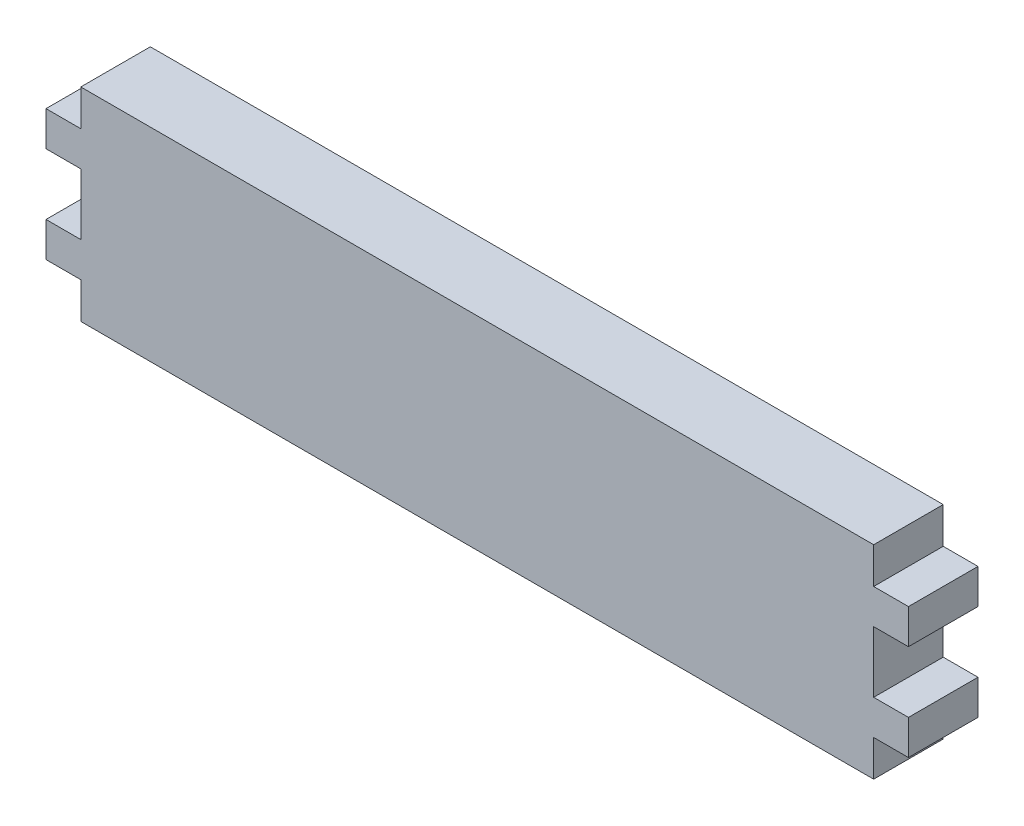
ISO-10303-21;
HEADER;
FILE_DESCRIPTION(('STEP AP214'),'2;1');
FILE_NAME('part.step','',(''),(''),'','','');
FILE_SCHEMA(('AUTOMOTIVE_DESIGN { 1 0 10303 214 1 1 1 1 }'));
ENDSEC;
DATA;
#1=APPLICATION_CONTEXT('core data for automotive mechanical design processes');
#2=APPLICATION_PROTOCOL_DEFINITION('international standard','automotive_design',2000,#1);
#3=PRODUCT_CONTEXT('',#1,'mechanical');
#4=PRODUCT('Part','Part','',(#3));
#5=PRODUCT_RELATED_PRODUCT_CATEGORY('part','',(#4));
#6=PRODUCT_DEFINITION_FORMATION('','',#4);
#7=PRODUCT_DEFINITION_CONTEXT('part definition',#1,'design');
#8=PRODUCT_DEFINITION('design','',#6,#7);
#9=PRODUCT_DEFINITION_SHAPE('','',#8);
#10=(LENGTH_UNIT() NAMED_UNIT(*) SI_UNIT(.MILLI.,.METRE.));
#11=(NAMED_UNIT(*) PLANE_ANGLE_UNIT() SI_UNIT($,.RADIAN.));
#12=(NAMED_UNIT(*) SI_UNIT($,.STERADIAN.) SOLID_ANGLE_UNIT());
#13=UNCERTAINTY_MEASURE_WITH_UNIT(LENGTH_MEASURE(1.E-05),#10,'distance_accuracy_value','');
#14=(GEOMETRIC_REPRESENTATION_CONTEXT(3) GLOBAL_UNCERTAINTY_ASSIGNED_CONTEXT((#13)) GLOBAL_UNIT_ASSIGNED_CONTEXT((#10,
#11,#12)) REPRESENTATION_CONTEXT('',''));
#15=CARTESIAN_POINT('',(0.,0.,0.));
#16=DIRECTION('',(0.,0.,1.));
#17=DIRECTION('',(1.,0.,0.));
#18=AXIS2_PLACEMENT_3D('',#15,#16,#17);
#19=CARTESIAN_POINT('',(308.587272516352,-10.5892165461423,87.2437164679682));
#20=DIRECTION('',(0.,-1.,0.));
#21=DIRECTION('',(0.,0.,-1.));
#22=AXIS2_PLACEMENT_3D('',#19,#20,#21);
#23=PLANE('',#22);
#24=DIRECTION('',(-1.,0.,0.));
#25=VECTOR('',#24,1.);
#26=CARTESIAN_POINT('',(308.587272516352,-10.5892165461423,6.35000000000004));
#27=LINE('',#26,#25);
#28=CARTESIAN_POINT('',(308.587272516352,-10.5892165461423,6.35000000000004));
#29=VERTEX_POINT('',#28);
#30=CARTESIAN_POINT('',(305.412272516352,-10.5892165461423,6.35000000000004));
#31=VERTEX_POINT('',#30);
#32=EDGE_CURVE('E242',#29,#31,#27,.T.);
#33=ORIENTED_EDGE('',*,*,#32,.F.);
#34=DIRECTION('',(0.,0.,-1.));
#35=VECTOR('',#34,1.);
#36=CARTESIAN_POINT('',(308.587272516352,-10.5892165461423,87.2437164679682));
#37=LINE('',#36,#35);
#38=CARTESIAN_POINT('',(308.587272516352,-10.5892165461423,0.));
#39=VERTEX_POINT('',#38);
#40=EDGE_CURVE('E36',#29,#39,#37,.T.);
#41=ORIENTED_EDGE('',*,*,#40,.T.);
#42=DIRECTION('',(-1.,0.,0.));
#43=VECTOR('',#42,1.);
#44=CARTESIAN_POINT('',(308.587272516352,-10.5892165461423,0.));
#45=LINE('',#44,#43);
#46=CARTESIAN_POINT('',(305.412272516352,-10.5892165461423,0.));
#47=VERTEX_POINT('',#46);
#48=EDGE_CURVE('E250',#39,#47,#45,.T.);
#49=ORIENTED_EDGE('',*,*,#48,.T.);
#50=DIRECTION('',(0.,0.,-1.));
#51=VECTOR('',#50,1.);
#52=CARTESIAN_POINT('',(305.412272516352,-10.5892165461423,87.2437164679682));
#53=LINE('',#52,#51);
#54=EDGE_CURVE('E135',#31,#47,#53,.T.);
#55=ORIENTED_EDGE('',*,*,#54,.F.);
#56=EDGE_LOOP('',(#33,#41,#49,#55));
#57=FACE_BOUND('',#56,.T.);
#58=ADVANCED_FACE('F32',(#57),#23,.F.);
#59=CARTESIAN_POINT('',(305.412272516352,-10.5892165461423,87.2437164679682));
#60=DIRECTION('',(-1.,0.,0.));
#61=DIRECTION('',(0.,0.,1.));
#62=AXIS2_PLACEMENT_3D('',#59,#60,#61);
#63=PLANE('',#62);
#64=DIRECTION('',(0.,1.,0.));
#65=VECTOR('',#64,1.);
#66=CARTESIAN_POINT('',(305.412272516352,-10.5892165461423,6.35000000000004));
#67=LINE('',#66,#65);
#68=CARTESIAN_POINT('',(305.412272516352,-7.28721654614226,6.35000000000004));
#69=VERTEX_POINT('',#68);
#70=EDGE_CURVE('E142',#31,#69,#67,.T.);
#71=ORIENTED_EDGE('',*,*,#70,.F.);
#72=ORIENTED_EDGE('',*,*,#54,.T.);
#73=DIRECTION('',(0.,1.,0.));
#74=VECTOR('',#73,1.);
#75=CARTESIAN_POINT('',(305.412272516352,-10.5892165461423,0.));
#76=LINE('',#75,#74);
#77=CARTESIAN_POINT('',(305.412272516352,-7.28721654614226,0.));
#78=VERTEX_POINT('',#77);
#79=EDGE_CURVE('E249',#47,#78,#76,.T.);
#80=ORIENTED_EDGE('',*,*,#79,.T.);
#81=DIRECTION('',(0.,0.,-1.));
#82=VECTOR('',#81,1.);
#83=CARTESIAN_POINT('',(305.412272516352,-7.28721654614226,87.2437164679682));
#84=LINE('',#83,#82);
#85=EDGE_CURVE('E251',#69,#78,#84,.T.);
#86=ORIENTED_EDGE('',*,*,#85,.F.);
#87=EDGE_LOOP('',(#71,#72,#80,#86));
#88=FACE_BOUND('',#87,.T.);
#89=ADVANCED_FACE('F330',(#88),#63,.F.);
#90=CARTESIAN_POINT('',(305.412272516352,-7.28721654614226,87.2437164679682));
#91=DIRECTION('',(0.,-1.,0.));
#92=DIRECTION('',(1.,0.,0.));
#93=AXIS2_PLACEMENT_3D('',#90,#91,#92);
#94=PLANE('',#93);
#95=DIRECTION('',(-1.,0.,0.));
#96=VECTOR('',#95,1.);
#97=CARTESIAN_POINT('',(305.412272516352,-7.28721654614226,6.35000000000004));
#98=LINE('',#97,#96);
#99=CARTESIAN_POINT('',(233.022272516352,-7.28721654614227,6.35000000000004));
#100=VERTEX_POINT('',#99);
#101=EDGE_CURVE('E238',#69,#100,#98,.T.);
#102=ORIENTED_EDGE('',*,*,#101,.F.);
#103=ORIENTED_EDGE('',*,*,#85,.T.);
#104=DIRECTION('',(-1.,0.,0.));
#105=VECTOR('',#104,1.);
#106=CARTESIAN_POINT('',(305.412272516352,-7.28721654614226,0.));
#107=LINE('',#106,#105);
#108=CARTESIAN_POINT('',(233.022272516352,-7.28721654614227,0.));
#109=VERTEX_POINT('',#108);
#110=EDGE_CURVE('E253',#78,#109,#107,.T.);
#111=ORIENTED_EDGE('',*,*,#110,.T.);
#112=DIRECTION('',(0.,0.,-1.));
#113=VECTOR('',#112,1.);
#114=CARTESIAN_POINT('',(233.022272516352,-7.28721654614227,87.2437164679682));
#115=LINE('',#114,#113);
#116=EDGE_CURVE('E254',#100,#109,#115,.T.);
#117=ORIENTED_EDGE('',*,*,#116,.F.);
#118=EDGE_LOOP('',(#102,#103,#111,#117));
#119=FACE_BOUND('',#118,.T.);
#120=ADVANCED_FACE('F334',(#119),#94,.F.);
#121=CARTESIAN_POINT('',(233.022272516352,-7.28721654614227,87.2437164679682));
#122=DIRECTION('',(1.,0.,0.));
#123=DIRECTION('',(0.,0.,-1.));
#124=AXIS2_PLACEMENT_3D('',#121,#122,#123);
#125=PLANE('',#124);
#126=DIRECTION('',(0.,-1.,0.));
#127=VECTOR('',#126,1.);
#128=CARTESIAN_POINT('',(233.022272516352,-7.28721654614227,6.35000000000004));
#129=LINE('',#128,#127);
#130=CARTESIAN_POINT('',(233.022272516352,-10.5892165461423,6.35000000000004));
#131=VERTEX_POINT('',#130);
#132=EDGE_CURVE('E213',#100,#131,#129,.T.);
#133=ORIENTED_EDGE('',*,*,#132,.F.);
#134=ORIENTED_EDGE('',*,*,#116,.T.);
#135=DIRECTION('',(0.,-1.,0.));
#136=VECTOR('',#135,1.);
#137=CARTESIAN_POINT('',(233.022272516352,-7.28721654614227,0.));
#138=LINE('',#137,#136);
#139=CARTESIAN_POINT('',(233.022272516352,-10.5892165461423,0.));
#140=VERTEX_POINT('',#139);
#141=EDGE_CURVE('E235',#109,#140,#138,.T.);
#142=ORIENTED_EDGE('',*,*,#141,.T.);
#143=DIRECTION('',(0.,0.,-1.));
#144=VECTOR('',#143,1.);
#145=CARTESIAN_POINT('',(233.022272516352,-10.5892165461423,87.2437164679682));
#146=LINE('',#145,#144);
#147=EDGE_CURVE('E232',#131,#140,#146,.T.);
#148=ORIENTED_EDGE('',*,*,#147,.F.);
#149=EDGE_LOOP('',(#133,#134,#142,#148));
#150=FACE_BOUND('',#149,.T.);
#151=ADVANCED_FACE('F336',(#150),#125,.F.);
#152=CARTESIAN_POINT('',(229.847272516352,-10.5892165461423,87.2437164679682));
#153=DIRECTION('',(0.,1.,0.));
#154=DIRECTION('',(-1.,0.,0.));
#155=AXIS2_PLACEMENT_3D('',#152,#153,#154);
#156=PLANE('',#155);
#157=DIRECTION('',(0.,0.,-1.));
#158=VECTOR('',#157,1.);
#159=CARTESIAN_POINT('',(229.847272516352,-10.5892165461423,87.2437164679682));
#160=LINE('',#159,#158);
#161=CARTESIAN_POINT('',(229.847272516352,-10.5892165461423,6.35000000000004));
#162=VERTEX_POINT('',#161);
#163=CARTESIAN_POINT('',(229.847272516352,-10.5892165461423,0.));
#164=VERTEX_POINT('',#163);
#165=EDGE_CURVE('E229',#162,#164,#160,.T.);
#166=ORIENTED_EDGE('',*,*,#165,.F.);
#167=DIRECTION('',(1.,0.,0.));
#168=VECTOR('',#167,1.);
#169=CARTESIAN_POINT('',(229.847272516352,-10.5892165461423,6.35000000000004));
#170=LINE('',#169,#168);
#171=EDGE_CURVE('E233',#162,#131,#170,.T.);
#172=ORIENTED_EDGE('',*,*,#171,.T.);
#173=ORIENTED_EDGE('',*,*,#147,.T.);
#174=DIRECTION('',(1.,0.,0.));
#175=VECTOR('',#174,1.);
#176=CARTESIAN_POINT('',(229.847272516352,-10.5892165461423,0.));
#177=LINE('',#176,#175);
#178=EDGE_CURVE('E247',#164,#140,#177,.T.);
#179=ORIENTED_EDGE('',*,*,#178,.F.);
#180=EDGE_LOOP('',(#166,#172,#173,#179));
#181=FACE_BOUND('',#180,.T.);
#182=ADVANCED_FACE('F341',(#181),#156,.T.);
#183=CARTESIAN_POINT('',(229.847272516352,-13.7642165461423,87.2437164679682));
#184=DIRECTION('',(-1.,0.,0.));
#185=DIRECTION('',(0.,0.,1.));
#186=AXIS2_PLACEMENT_3D('',#183,#184,#185);
#187=PLANE('',#186);
#188=DIRECTION('',(0.,0.,-1.));
#189=VECTOR('',#188,1.);
#190=CARTESIAN_POINT('',(229.847272516352,-13.7642165461423,87.2437164679682));
#191=LINE('',#190,#189);
#192=CARTESIAN_POINT('',(229.847272516352,-13.7642165461423,6.35000000000004));
#193=VERTEX_POINT('',#192);
#194=CARTESIAN_POINT('',(229.847272516352,-13.7642165461423,0.));
#195=VERTEX_POINT('',#194);
#196=EDGE_CURVE('E226',#193,#195,#191,.T.);
#197=ORIENTED_EDGE('',*,*,#196,.F.);
#198=DIRECTION('',(0.,1.,0.));
#199=VECTOR('',#198,1.);
#200=CARTESIAN_POINT('',(229.847272516352,-13.7642165461423,6.35000000000004));
#201=LINE('',#200,#199);
#202=EDGE_CURVE('E230',#193,#162,#201,.T.);
#203=ORIENTED_EDGE('',*,*,#202,.T.);
#204=ORIENTED_EDGE('',*,*,#165,.T.);
#205=DIRECTION('',(0.,1.,0.));
#206=VECTOR('',#205,1.);
#207=CARTESIAN_POINT('',(229.847272516352,-13.7642165461423,0.));
#208=LINE('',#207,#206);
#209=EDGE_CURVE('E313',#195,#164,#208,.T.);
#210=ORIENTED_EDGE('',*,*,#209,.F.);
#211=EDGE_LOOP('',(#197,#203,#204,#210));
#212=FACE_BOUND('',#211,.T.);
#213=ADVANCED_FACE('F347',(#212),#187,.T.);
#214=CARTESIAN_POINT('',(233.022272516352,-13.7642165461423,87.2437164679682));
#215=DIRECTION('',(0.,-1.,0.));
#216=DIRECTION('',(1.,0.,0.));
#217=AXIS2_PLACEMENT_3D('',#214,#215,#216);
#218=PLANE('',#217);
#219=DIRECTION('',(0.,0.,-1.));
#220=VECTOR('',#219,1.);
#221=CARTESIAN_POINT('',(233.022272516352,-13.7642165461423,87.2437164679682));
#222=LINE('',#221,#220);
#223=CARTESIAN_POINT('',(233.022272516352,-13.7642165461423,6.35000000000004));
#224=VERTEX_POINT('',#223);
#225=CARTESIAN_POINT('',(233.022272516352,-13.7642165461423,0.));
#226=VERTEX_POINT('',#225);
#227=EDGE_CURVE('E223',#224,#226,#222,.T.);
#228=ORIENTED_EDGE('',*,*,#227,.F.);
#229=DIRECTION('',(-1.,0.,0.));
#230=VECTOR('',#229,1.);
#231=CARTESIAN_POINT('',(233.022272516352,-13.7642165461423,6.35000000000004));
#232=LINE('',#231,#230);
#233=EDGE_CURVE('E227',#224,#193,#232,.T.);
#234=ORIENTED_EDGE('',*,*,#233,.T.);
#235=ORIENTED_EDGE('',*,*,#196,.T.);
#236=DIRECTION('',(-1.,0.,0.));
#237=VECTOR('',#236,1.);
#238=CARTESIAN_POINT('',(233.022272516352,-13.7642165461423,0.));
#239=LINE('',#238,#237);
#240=EDGE_CURVE('E310',#226,#195,#239,.T.);
#241=ORIENTED_EDGE('',*,*,#240,.F.);
#242=EDGE_LOOP('',(#228,#234,#235,#241));
#243=FACE_BOUND('',#242,.T.);
#244=ADVANCED_FACE('F352',(#243),#218,.T.);
#245=CARTESIAN_POINT('',(233.022272516352,-19.3522165461423,87.2437164679682));
#246=DIRECTION('',(-1.,0.,0.));
#247=DIRECTION('',(0.,0.,1.));
#248=AXIS2_PLACEMENT_3D('',#245,#246,#247);
#249=PLANE('',#248);
#250=DIRECTION('',(0.,0.,-1.));
#251=VECTOR('',#250,1.);
#252=CARTESIAN_POINT('',(233.022272516352,-19.3522165461423,87.2437164679682));
#253=LINE('',#252,#251);
#254=CARTESIAN_POINT('',(233.022272516352,-19.3522165461423,6.35000000000004));
#255=VERTEX_POINT('',#254);
#256=CARTESIAN_POINT('',(233.022272516352,-19.3522165461423,0.));
#257=VERTEX_POINT('',#256);
#258=EDGE_CURVE('E220',#255,#257,#253,.T.);
#259=ORIENTED_EDGE('',*,*,#258,.F.);
#260=DIRECTION('',(0.,1.,0.));
#261=VECTOR('',#260,1.);
#262=CARTESIAN_POINT('',(233.022272516352,-19.3522165461423,6.35000000000004));
#263=LINE('',#262,#261);
#264=EDGE_CURVE('E224',#255,#224,#263,.T.);
#265=ORIENTED_EDGE('',*,*,#264,.T.);
#266=ORIENTED_EDGE('',*,*,#227,.T.);
#267=DIRECTION('',(0.,1.,0.));
#268=VECTOR('',#267,1.);
#269=CARTESIAN_POINT('',(233.022272516352,-19.3522165461423,0.));
#270=LINE('',#269,#268);
#271=EDGE_CURVE('E307',#257,#226,#270,.T.);
#272=ORIENTED_EDGE('',*,*,#271,.F.);
#273=EDGE_LOOP('',(#259,#265,#266,#272));
#274=FACE_BOUND('',#273,.T.);
#275=ADVANCED_FACE('F356',(#274),#249,.T.);
#276=CARTESIAN_POINT('',(229.847272516352,-19.3522165461423,87.2437164679682));
#277=DIRECTION('',(0.,1.,0.));
#278=DIRECTION('',(-1.,0.,0.));
#279=AXIS2_PLACEMENT_3D('',#276,#277,#278);
#280=PLANE('',#279);
#281=DIRECTION('',(0.,0.,-1.));
#282=VECTOR('',#281,1.);
#283=CARTESIAN_POINT('',(229.847272516352,-19.3522165461423,87.2437164679682));
#284=LINE('',#283,#282);
#285=CARTESIAN_POINT('',(229.847272516352,-19.3522165461423,6.35000000000004));
#286=VERTEX_POINT('',#285);
#287=CARTESIAN_POINT('',(229.847272516352,-19.3522165461423,0.));
#288=VERTEX_POINT('',#287);
#289=EDGE_CURVE('E217',#286,#288,#284,.T.);
#290=ORIENTED_EDGE('',*,*,#289,.F.);
#291=DIRECTION('',(1.,0.,0.));
#292=VECTOR('',#291,1.);
#293=CARTESIAN_POINT('',(229.847272516352,-19.3522165461423,6.35000000000004));
#294=LINE('',#293,#292);
#295=EDGE_CURVE('E221',#286,#255,#294,.T.);
#296=ORIENTED_EDGE('',*,*,#295,.T.);
#297=ORIENTED_EDGE('',*,*,#258,.T.);
#298=DIRECTION('',(1.,0.,0.));
#299=VECTOR('',#298,1.);
#300=CARTESIAN_POINT('',(229.847272516352,-19.3522165461423,0.));
#301=LINE('',#300,#299);
#302=EDGE_CURVE('E304',#288,#257,#301,.T.);
#303=ORIENTED_EDGE('',*,*,#302,.F.);
#304=EDGE_LOOP('',(#290,#296,#297,#303));
#305=FACE_BOUND('',#304,.T.);
#306=ADVANCED_FACE('F362',(#305),#280,.T.);
#307=CARTESIAN_POINT('',(229.847272516352,-22.5272165461423,87.2437164679682));
#308=DIRECTION('',(-1.,0.,0.));
#309=DIRECTION('',(0.,0.,1.));
#310=AXIS2_PLACEMENT_3D('',#307,#308,#309);
#311=PLANE('',#310);
#312=DIRECTION('',(0.,0.,-1.));
#313=VECTOR('',#312,1.);
#314=CARTESIAN_POINT('',(229.847272516352,-22.5272165461423,87.2437164679682));
#315=LINE('',#314,#313);
#316=CARTESIAN_POINT('',(229.847272516352,-22.5272165461423,6.35000000000004));
#317=VERTEX_POINT('',#316);
#318=CARTESIAN_POINT('',(229.847272516352,-22.5272165461423,0.));
#319=VERTEX_POINT('',#318);
#320=EDGE_CURVE('E216',#317,#319,#315,.T.);
#321=ORIENTED_EDGE('',*,*,#320,.F.);
#322=DIRECTION('',(0.,1.,0.));
#323=VECTOR('',#322,1.);
#324=CARTESIAN_POINT('',(229.847272516352,-22.5272165461423,6.35000000000004));
#325=LINE('',#324,#323);
#326=EDGE_CURVE('E218',#317,#286,#325,.T.);
#327=ORIENTED_EDGE('',*,*,#326,.T.);
#328=ORIENTED_EDGE('',*,*,#289,.T.);
#329=DIRECTION('',(0.,1.,0.));
#330=VECTOR('',#329,1.);
#331=CARTESIAN_POINT('',(229.847272516352,-22.5272165461423,0.));
#332=LINE('',#331,#330);
#333=EDGE_CURVE('E301',#319,#288,#332,.T.);
#334=ORIENTED_EDGE('',*,*,#333,.F.);
#335=EDGE_LOOP('',(#321,#327,#328,#334));
#336=FACE_BOUND('',#335,.T.);
#337=ADVANCED_FACE('F367',(#336),#311,.T.);
#338=CARTESIAN_POINT('',(233.022272516352,-22.5272165461423,87.2437164679682));
#339=DIRECTION('',(0.,-1.,0.));
#340=DIRECTION('',(1.,0.,0.));
#341=AXIS2_PLACEMENT_3D('',#338,#339,#340);
#342=PLANE('',#341);
#343=DIRECTION('',(0.,0.,-1.));
#344=VECTOR('',#343,1.);
#345=CARTESIAN_POINT('',(233.022272516352,-22.5272165461423,87.2437164679682));
#346=LINE('',#345,#344);
#347=CARTESIAN_POINT('',(233.022272516352,-22.5272165461423,6.35000000000004));
#348=VERTEX_POINT('',#347);
#349=CARTESIAN_POINT('',(233.022272516352,-22.5272165461423,0.));
#350=VERTEX_POINT('',#349);
#351=EDGE_CURVE('E263',#348,#350,#346,.T.);
#352=ORIENTED_EDGE('',*,*,#351,.F.);
#353=DIRECTION('',(-1.,0.,0.));
#354=VECTOR('',#353,1.);
#355=CARTESIAN_POINT('',(233.022272516352,-22.5272165461423,6.35000000000004));
#356=LINE('',#355,#354);
#357=EDGE_CURVE('E214',#348,#317,#356,.T.);
#358=ORIENTED_EDGE('',*,*,#357,.T.);
#359=ORIENTED_EDGE('',*,*,#320,.T.);
#360=DIRECTION('',(-1.,0.,0.));
#361=VECTOR('',#360,1.);
#362=CARTESIAN_POINT('',(233.022272516352,-22.5272165461423,0.));
#363=LINE('',#362,#361);
#364=EDGE_CURVE('E288',#350,#319,#363,.T.);
#365=ORIENTED_EDGE('',*,*,#364,.F.);
#366=EDGE_LOOP('',(#352,#358,#359,#365));
#367=FACE_BOUND('',#366,.T.);
#368=ADVANCED_FACE('F371',(#367),#342,.T.);
#369=CARTESIAN_POINT('',(233.022272516352,-22.5272165461423,87.2437164679682));
#370=DIRECTION('',(1.,0.,0.));
#371=DIRECTION('',(0.,0.,-1.));
#372=AXIS2_PLACEMENT_3D('',#369,#370,#371);
#373=PLANE('',#372);
#374=DIRECTION('',(0.,-1.,0.));
#375=VECTOR('',#374,1.);
#376=CARTESIAN_POINT('',(233.022272516352,-22.5272165461423,6.35000000000004));
#377=LINE('',#376,#375);
#378=CARTESIAN_POINT('',(233.022272516352,-25.8292165461423,6.35000000000004));
#379=VERTEX_POINT('',#378);
#380=EDGE_CURVE('E210',#348,#379,#377,.T.);
#381=ORIENTED_EDGE('',*,*,#380,.F.);
#382=ORIENTED_EDGE('',*,*,#351,.T.);
#383=DIRECTION('',(0.,-1.,0.));
#384=VECTOR('',#383,1.);
#385=CARTESIAN_POINT('',(233.022272516352,-22.5272165461423,0.));
#386=LINE('',#385,#384);
#387=CARTESIAN_POINT('',(233.022272516352,-25.8292165461423,0.));
#388=VERTEX_POINT('',#387);
#389=EDGE_CURVE('E265',#350,#388,#386,.T.);
#390=ORIENTED_EDGE('',*,*,#389,.T.);
#391=DIRECTION('',(0.,0.,-1.));
#392=VECTOR('',#391,1.);
#393=CARTESIAN_POINT('',(233.022272516352,-25.8292165461423,87.2437164679682));
#394=LINE('',#393,#392);
#395=EDGE_CURVE('E266',#379,#388,#394,.T.);
#396=ORIENTED_EDGE('',*,*,#395,.F.);
#397=EDGE_LOOP('',(#381,#382,#390,#396));
#398=FACE_BOUND('',#397,.T.);
#399=ADVANCED_FACE('F374',(#398),#373,.F.);
#400=CARTESIAN_POINT('',(233.022272516352,-25.8292165461423,87.2437164679682));
#401=DIRECTION('',(0.,1.,0.));
#402=DIRECTION('',(0.,0.,1.));
#403=AXIS2_PLACEMENT_3D('',#400,#401,#402);
#404=PLANE('',#403);
#405=DIRECTION('',(1.,0.,0.));
#406=VECTOR('',#405,1.);
#407=CARTESIAN_POINT('',(233.022272516352,-25.8292165461423,6.35000000000004));
#408=LINE('',#407,#406);
#409=CARTESIAN_POINT('',(305.412272516352,-25.8292165461423,6.35000000000004));
#410=VERTEX_POINT('',#409);
#411=EDGE_CURVE('E207',#379,#410,#408,.T.);
#412=ORIENTED_EDGE('',*,*,#411,.F.);
#413=ORIENTED_EDGE('',*,*,#395,.T.);
#414=DIRECTION('',(1.,0.,0.));
#415=VECTOR('',#414,1.);
#416=CARTESIAN_POINT('',(233.022272516352,-25.8292165461423,0.));
#417=LINE('',#416,#415);
#418=CARTESIAN_POINT('',(305.412272516352,-25.8292165461423,0.));
#419=VERTEX_POINT('',#418);
#420=EDGE_CURVE('E268',#388,#419,#417,.T.);
#421=ORIENTED_EDGE('',*,*,#420,.T.);
#422=DIRECTION('',(0.,0.,-1.));
#423=VECTOR('',#422,1.);
#424=CARTESIAN_POINT('',(305.412272516352,-25.8292165461423,87.2437164679682));
#425=LINE('',#424,#423);
#426=EDGE_CURVE('E269',#410,#419,#425,.T.);
#427=ORIENTED_EDGE('',*,*,#426,.F.);
#428=EDGE_LOOP('',(#412,#413,#421,#427));
#429=FACE_BOUND('',#428,.T.);
#430=ADVANCED_FACE('F378',(#429),#404,.F.);
#431=CARTESIAN_POINT('',(305.412272516352,-25.8292165461423,87.2437164679682));
#432=DIRECTION('',(-1.,0.,0.));
#433=DIRECTION('',(0.,0.,1.));
#434=AXIS2_PLACEMENT_3D('',#431,#432,#433);
#435=PLANE('',#434);
#436=DIRECTION('',(0.,1.,0.));
#437=VECTOR('',#436,1.);
#438=CARTESIAN_POINT('',(305.412272516352,-25.8292165461423,6.35000000000004));
#439=LINE('',#438,#437);
#440=CARTESIAN_POINT('',(305.412272516352,-22.5272165461423,6.35000000000004));
#441=VERTEX_POINT('',#440);
#442=EDGE_CURVE('E204',#410,#441,#439,.T.);
#443=ORIENTED_EDGE('',*,*,#442,.F.);
#444=ORIENTED_EDGE('',*,*,#426,.T.);
#445=DIRECTION('',(0.,1.,0.));
#446=VECTOR('',#445,1.);
#447=CARTESIAN_POINT('',(305.412272516352,-25.8292165461423,0.));
#448=LINE('',#447,#446);
#449=CARTESIAN_POINT('',(305.412272516352,-22.5272165461423,0.));
#450=VERTEX_POINT('',#449);
#451=EDGE_CURVE('E271',#419,#450,#448,.T.);
#452=ORIENTED_EDGE('',*,*,#451,.T.);
#453=DIRECTION('',(0.,0.,-1.));
#454=VECTOR('',#453,1.);
#455=CARTESIAN_POINT('',(305.412272516352,-22.5272165461423,87.2437164679682));
#456=LINE('',#455,#454);
#457=EDGE_CURVE('E272',#441,#450,#456,.T.);
#458=ORIENTED_EDGE('',*,*,#457,.F.);
#459=EDGE_LOOP('',(#443,#444,#452,#458));
#460=FACE_BOUND('',#459,.T.);
#461=ADVANCED_FACE('F382',(#460),#435,.F.);
#462=CARTESIAN_POINT('',(305.412272516352,-22.5272165461423,87.2437164679682));
#463=DIRECTION('',(0.,1.,0.));
#464=DIRECTION('',(0.,0.,1.));
#465=AXIS2_PLACEMENT_3D('',#462,#463,#464);
#466=PLANE('',#465);
#467=DIRECTION('',(1.,0.,0.));
#468=VECTOR('',#467,1.);
#469=CARTESIAN_POINT('',(305.412272516352,-22.5272165461423,6.35000000000004));
#470=LINE('',#469,#468);
#471=CARTESIAN_POINT('',(308.587272516352,-22.5272165461423,6.35000000000004));
#472=VERTEX_POINT('',#471);
#473=EDGE_CURVE('E195',#441,#472,#470,.T.);
#474=ORIENTED_EDGE('',*,*,#473,.F.);
#475=ORIENTED_EDGE('',*,*,#457,.T.);
#476=DIRECTION('',(1.,0.,0.));
#477=VECTOR('',#476,1.);
#478=CARTESIAN_POINT('',(305.412272516352,-22.5272165461423,0.));
#479=LINE('',#478,#477);
#480=CARTESIAN_POINT('',(308.587272516352,-22.5272165461423,0.));
#481=VERTEX_POINT('',#480);
#482=EDGE_CURVE('E274',#450,#481,#479,.T.);
#483=ORIENTED_EDGE('',*,*,#482,.T.);
#484=DIRECTION('',(0.,0.,-1.));
#485=VECTOR('',#484,1.);
#486=CARTESIAN_POINT('',(308.587272516352,-22.5272165461423,87.2437164679682));
#487=LINE('',#486,#485);
#488=EDGE_CURVE('E275',#472,#481,#487,.T.);
#489=ORIENTED_EDGE('',*,*,#488,.F.);
#490=EDGE_LOOP('',(#474,#475,#483,#489));
#491=FACE_BOUND('',#490,.T.);
#492=ADVANCED_FACE('F387',(#491),#466,.F.);
#493=CARTESIAN_POINT('',(308.587272516352,-22.5272165461423,87.2437164679682));
#494=DIRECTION('',(-1.,0.,0.));
#495=DIRECTION('',(0.,0.,1.));
#496=AXIS2_PLACEMENT_3D('',#493,#494,#495);
#497=PLANE('',#496);
#498=DIRECTION('',(0.,1.,0.));
#499=VECTOR('',#498,1.);
#500=CARTESIAN_POINT('',(308.587272516352,-22.5272165461423,6.35000000000004));
#501=LINE('',#500,#499);
#502=CARTESIAN_POINT('',(308.587272516352,-19.3522165461423,6.35000000000004));
#503=VERTEX_POINT('',#502);
#504=EDGE_CURVE('E193',#472,#503,#501,.T.);
#505=ORIENTED_EDGE('',*,*,#504,.F.);
#506=ORIENTED_EDGE('',*,*,#488,.T.);
#507=DIRECTION('',(0.,1.,0.));
#508=VECTOR('',#507,1.);
#509=CARTESIAN_POINT('',(308.587272516352,-22.5272165461423,0.));
#510=LINE('',#509,#508);
#511=CARTESIAN_POINT('',(308.587272516352,-19.3522165461423,0.));
#512=VERTEX_POINT('',#511);
#513=EDGE_CURVE('E200',#481,#512,#510,.T.);
#514=ORIENTED_EDGE('',*,*,#513,.T.);
#515=DIRECTION('',(0.,0.,-1.));
#516=VECTOR('',#515,1.);
#517=CARTESIAN_POINT('',(308.587272516352,-19.3522165461423,87.2437164679682));
#518=LINE('',#517,#516);
#519=EDGE_CURVE('E199',#503,#512,#518,.T.);
#520=ORIENTED_EDGE('',*,*,#519,.F.);
#521=EDGE_LOOP('',(#505,#506,#514,#520));
#522=FACE_BOUND('',#521,.T.);
#523=ADVANCED_FACE('F390',(#522),#497,.F.);
#524=CARTESIAN_POINT('',(305.412272516352,-19.3522165461423,87.2437164679682));
#525=DIRECTION('',(0.,1.,0.));
#526=DIRECTION('',(0.,0.,1.));
#527=AXIS2_PLACEMENT_3D('',#524,#525,#526);
#528=PLANE('',#527);
#529=DIRECTION('',(0.,0.,-1.));
#530=VECTOR('',#529,1.);
#531=CARTESIAN_POINT('',(305.412272516352,-19.3522165461423,87.2437164679682));
#532=LINE('',#531,#530);
#533=CARTESIAN_POINT('',(305.412272516352,-19.3522165461423,6.35000000000004));
#534=VERTEX_POINT('',#533);
#535=CARTESIAN_POINT('',(305.412272516352,-19.3522165461423,0.));
#536=VERTEX_POINT('',#535);
#537=EDGE_CURVE('E278',#534,#536,#532,.T.);
#538=ORIENTED_EDGE('',*,*,#537,.F.);
#539=DIRECTION('',(1.,0.,0.));
#540=VECTOR('',#539,1.);
#541=CARTESIAN_POINT('',(305.412272516352,-19.3522165461423,6.35000000000004));
#542=LINE('',#541,#540);
#543=EDGE_CURVE('E192',#534,#503,#542,.T.);
#544=ORIENTED_EDGE('',*,*,#543,.T.);
#545=ORIENTED_EDGE('',*,*,#519,.T.);
#546=DIRECTION('',(1.,0.,0.));
#547=VECTOR('',#546,1.);
#548=CARTESIAN_POINT('',(305.412272516352,-19.3522165461423,0.));
#549=LINE('',#548,#547);
#550=EDGE_CURVE('E280',#536,#512,#549,.T.);
#551=ORIENTED_EDGE('',*,*,#550,.F.);
#552=EDGE_LOOP('',(#538,#544,#545,#551));
#553=FACE_BOUND('',#552,.T.);
#554=ADVANCED_FACE('F394',(#553),#528,.T.);
#555=CARTESIAN_POINT('',(305.412272516352,-19.3522165461423,87.2437164679682));
#556=DIRECTION('',(-1.,0.,0.));
#557=DIRECTION('',(0.,0.,1.));
#558=AXIS2_PLACEMENT_3D('',#555,#556,#557);
#559=PLANE('',#558);
#560=DIRECTION('',(0.,1.,0.));
#561=VECTOR('',#560,1.);
#562=CARTESIAN_POINT('',(305.412272516352,-19.3522165461423,6.35000000000004));
#563=LINE('',#562,#561);
#564=CARTESIAN_POINT('',(305.412272516352,-13.7642165461423,6.35000000000004));
#565=VERTEX_POINT('',#564);
#566=EDGE_CURVE('E41',#534,#565,#563,.T.);
#567=ORIENTED_EDGE('',*,*,#566,.F.);
#568=ORIENTED_EDGE('',*,*,#537,.T.);
#569=DIRECTION('',(0.,1.,0.));
#570=VECTOR('',#569,1.);
#571=CARTESIAN_POINT('',(305.412272516352,-19.3522165461423,0.));
#572=LINE('',#571,#570);
#573=CARTESIAN_POINT('',(305.412272516352,-13.7642165461423,0.));
#574=VERTEX_POINT('',#573);
#575=EDGE_CURVE('E186',#536,#574,#572,.T.);
#576=ORIENTED_EDGE('',*,*,#575,.T.);
#577=DIRECTION('',(0.,0.,-1.));
#578=VECTOR('',#577,1.);
#579=CARTESIAN_POINT('',(305.412272516352,-13.7642165461423,87.2437164679682));
#580=LINE('',#579,#578);
#581=EDGE_CURVE('E177',#565,#574,#580,.T.);
#582=ORIENTED_EDGE('',*,*,#581,.F.);
#583=EDGE_LOOP('',(#567,#568,#576,#582));
#584=FACE_BOUND('',#583,.T.);
#585=ADVANCED_FACE('F183',(#584),#559,.F.);
#586=CARTESIAN_POINT('',(305.412272516352,-13.7642165461423,87.2437164679682));
#587=DIRECTION('',(0.,1.,0.));
#588=DIRECTION('',(0.,0.,1.));
#589=AXIS2_PLACEMENT_3D('',#586,#587,#588);
#590=PLANE('',#589);
#591=DIRECTION('',(1.,0.,0.));
#592=VECTOR('',#591,1.);
#593=CARTESIAN_POINT('',(305.412272516352,-13.7642165461423,6.35000000000004));
#594=LINE('',#593,#592);
#595=CARTESIAN_POINT('',(308.587272516352,-13.7642165461423,6.35000000000004));
#596=VERTEX_POINT('',#595);
#597=EDGE_CURVE('E11',#565,#596,#594,.T.);
#598=ORIENTED_EDGE('',*,*,#597,.F.);
#599=ORIENTED_EDGE('',*,*,#581,.T.);
#600=DIRECTION('',(1.,0.,0.));
#601=VECTOR('',#600,1.);
#602=CARTESIAN_POINT('',(305.412272516352,-13.7642165461423,0.));
#603=LINE('',#602,#601);
#604=CARTESIAN_POINT('',(308.587272516352,-13.7642165461423,0.));
#605=VERTEX_POINT('',#604);
#606=EDGE_CURVE('E188',#574,#605,#603,.T.);
#607=ORIENTED_EDGE('',*,*,#606,.T.);
#608=DIRECTION('',(0.,0.,-1.));
#609=VECTOR('',#608,1.);
#610=CARTESIAN_POINT('',(308.587272516352,-13.7642165461423,87.2437164679682));
#611=LINE('',#610,#609);
#612=EDGE_CURVE('E54',#596,#605,#611,.T.);
#613=ORIENTED_EDGE('',*,*,#612,.F.);
#614=EDGE_LOOP('',(#598,#599,#607,#613));
#615=FACE_BOUND('',#614,.T.);
#616=ADVANCED_FACE('F176',(#615),#590,.F.);
#617=CARTESIAN_POINT('',(308.587272516352,-13.7642165461423,87.2437164679682));
#618=DIRECTION('',(-1.,0.,0.));
#619=DIRECTION('',(0.,0.,1.));
#620=AXIS2_PLACEMENT_3D('',#617,#618,#619);
#621=PLANE('',#620);
#622=DIRECTION('',(0.,1.,0.));
#623=VECTOR('',#622,1.);
#624=CARTESIAN_POINT('',(308.587272516352,-13.7642165461423,6.35000000000004));
#625=LINE('',#624,#623);
#626=EDGE_CURVE('E245',#596,#29,#625,.T.);
#627=ORIENTED_EDGE('',*,*,#626,.F.);
#628=ORIENTED_EDGE('',*,*,#612,.T.);
#629=DIRECTION('',(0.,1.,0.));
#630=VECTOR('',#629,1.);
#631=CARTESIAN_POINT('',(308.587272516352,-13.7642165461423,0.));
#632=LINE('',#631,#630);
#633=EDGE_CURVE('E279',#605,#39,#632,.T.);
#634=ORIENTED_EDGE('',*,*,#633,.T.);
#635=ORIENTED_EDGE('',*,*,#40,.F.);
#636=EDGE_LOOP('',(#627,#628,#634,#635));
#637=FACE_BOUND('',#636,.T.);
#638=ADVANCED_FACE('F325',(#637),#621,.F.);
#639=CARTESIAN_POINT('',(0.,0.,0.));
#640=DIRECTION('',(0.,0.,-1.));
#641=DIRECTION('',(-1.,0.,0.));
#642=AXIS2_PLACEMENT_3D('',#639,#640,#641);
#643=PLANE('',#642);
#644=ORIENTED_EDGE('',*,*,#48,.F.);
#645=ORIENTED_EDGE('',*,*,#633,.F.);
#646=ORIENTED_EDGE('',*,*,#606,.F.);
#647=ORIENTED_EDGE('',*,*,#575,.F.);
#648=ORIENTED_EDGE('',*,*,#550,.T.);
#649=ORIENTED_EDGE('',*,*,#513,.F.);
#650=ORIENTED_EDGE('',*,*,#482,.F.);
#651=ORIENTED_EDGE('',*,*,#451,.F.);
#652=ORIENTED_EDGE('',*,*,#420,.F.);
#653=ORIENTED_EDGE('',*,*,#389,.F.);
#654=ORIENTED_EDGE('',*,*,#364,.T.);
#655=ORIENTED_EDGE('',*,*,#333,.T.);
#656=ORIENTED_EDGE('',*,*,#302,.T.);
#657=ORIENTED_EDGE('',*,*,#271,.T.);
#658=ORIENTED_EDGE('',*,*,#240,.T.);
#659=ORIENTED_EDGE('',*,*,#209,.T.);
#660=ORIENTED_EDGE('',*,*,#178,.T.);
#661=ORIENTED_EDGE('',*,*,#141,.F.);
#662=ORIENTED_EDGE('',*,*,#110,.F.);
#663=ORIENTED_EDGE('',*,*,#79,.F.);
#664=EDGE_LOOP('',(#644,#645,#646,#647,#648,#649,#650,#651,#652,#653,#654,#655,#656,#657,#658,
#659,#660,#661,#662,#663));
#665=FACE_BOUND('',#664,.T.);
#666=ADVANCED_FACE('F327',(#665),#643,.T.);
#667=CARTESIAN_POINT('',(308.710081358368,-13.7642165461423,6.35000000000004));
#668=DIRECTION('',(0.,0.,1.));
#669=DIRECTION('',(1.,0.,0.));
#670=AXIS2_PLACEMENT_3D('',#667,#668,#669);
#671=PLANE('',#670);
#672=ORIENTED_EDGE('',*,*,#626,.T.);
#673=ORIENTED_EDGE('',*,*,#32,.T.);
#674=ORIENTED_EDGE('',*,*,#70,.T.);
#675=ORIENTED_EDGE('',*,*,#101,.T.);
#676=ORIENTED_EDGE('',*,*,#132,.T.);
#677=ORIENTED_EDGE('',*,*,#171,.F.);
#678=ORIENTED_EDGE('',*,*,#202,.F.);
#679=ORIENTED_EDGE('',*,*,#233,.F.);
#680=ORIENTED_EDGE('',*,*,#264,.F.);
#681=ORIENTED_EDGE('',*,*,#295,.F.);
#682=ORIENTED_EDGE('',*,*,#326,.F.);
#683=ORIENTED_EDGE('',*,*,#357,.F.);
#684=ORIENTED_EDGE('',*,*,#380,.T.);
#685=ORIENTED_EDGE('',*,*,#411,.T.);
#686=ORIENTED_EDGE('',*,*,#442,.T.);
#687=ORIENTED_EDGE('',*,*,#473,.T.);
#688=ORIENTED_EDGE('',*,*,#504,.T.);
#689=ORIENTED_EDGE('',*,*,#543,.F.);
#690=ORIENTED_EDGE('',*,*,#566,.T.);
#691=ORIENTED_EDGE('',*,*,#597,.T.);
#692=EDGE_LOOP('',(#672,#673,#674,#675,#676,#677,#678,#679,#680,#681,#682,#683,#684,#685,#686,
#687,#688,#689,#690,#691));
#693=FACE_BOUND('',#692,.T.);
#694=ADVANCED_FACE('F34',(#693),#671,.T.);
#695=CLOSED_SHELL('',(#58,#89,#120,#151,#182,#213,#244,#275,#306,#337,#368,#399,#430,#461,#492,
#523,#554,#585,#616,#638,#666,#694));
#696=MANIFOLD_SOLID_BREP('B2',#695);
#697=ADVANCED_BREP_SHAPE_REPRESENTATION('',(#18,#696),#14);
#698=SHAPE_DEFINITION_REPRESENTATION(#9,#697);
ENDSEC;
END-ISO-10303-21;
